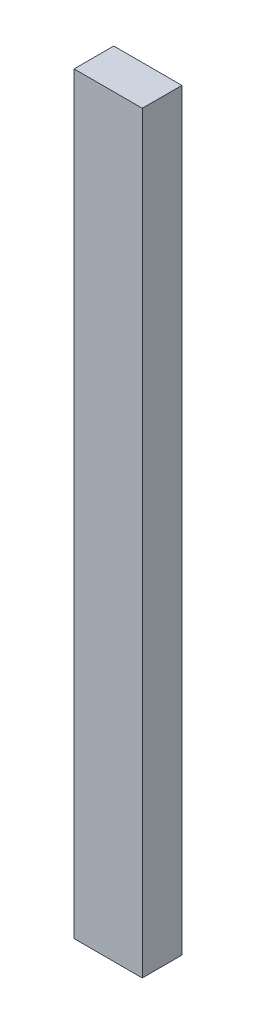
ISO-10303-21;
HEADER;
FILE_DESCRIPTION(('STEP AP214'),'2;1');
FILE_NAME('part.step','',(''),(''),'','','');
FILE_SCHEMA(('AUTOMOTIVE_DESIGN { 1 0 10303 214 1 1 1 1 }'));
ENDSEC;
DATA;
#1=APPLICATION_CONTEXT('core data for automotive mechanical design processes');
#2=APPLICATION_PROTOCOL_DEFINITION('international standard','automotive_design',2000,#1);
#3=PRODUCT_CONTEXT('',#1,'mechanical');
#4=PRODUCT('Part','Part','',(#3));
#5=PRODUCT_RELATED_PRODUCT_CATEGORY('part','',(#4));
#6=PRODUCT_DEFINITION_FORMATION('','',#4);
#7=PRODUCT_DEFINITION_CONTEXT('part definition',#1,'design');
#8=PRODUCT_DEFINITION('design','',#6,#7);
#9=PRODUCT_DEFINITION_SHAPE('','',#8);
#10=(LENGTH_UNIT() NAMED_UNIT(*) SI_UNIT(.MILLI.,.METRE.));
#11=(NAMED_UNIT(*) PLANE_ANGLE_UNIT() SI_UNIT($,.RADIAN.));
#12=(NAMED_UNIT(*) SI_UNIT($,.STERADIAN.) SOLID_ANGLE_UNIT());
#13=UNCERTAINTY_MEASURE_WITH_UNIT(LENGTH_MEASURE(1.E-05),#10,'distance_accuracy_value','');
#14=(GEOMETRIC_REPRESENTATION_CONTEXT(3) GLOBAL_UNCERTAINTY_ASSIGNED_CONTEXT((#13)) GLOBAL_UNIT_ASSIGNED_CONTEXT((#10,
#11,#12)) REPRESENTATION_CONTEXT('',''));
#15=CARTESIAN_POINT('',(0.,0.,0.));
#16=DIRECTION('',(0.,0.,1.));
#17=DIRECTION('',(1.,0.,0.));
#18=AXIS2_PLACEMENT_3D('',#15,#16,#17);
#19=CARTESIAN_POINT('',(0.,482.6,0.));
#20=DIRECTION('',(0.,0.,-1.));
#21=DIRECTION('',(-1.,0.,0.));
#22=AXIS2_PLACEMENT_3D('',#19,#20,#21);
#23=PLANE('',#22);
#24=DIRECTION('',(1.,0.,0.));
#25=VECTOR('',#24,1.);
#26=CARTESIAN_POINT('',(0.,0.,0.));
#27=LINE('',#26,#25);
#28=CARTESIAN_POINT('',(-18.288,0.,0.));
#29=VERTEX_POINT('',#28);
#30=CARTESIAN_POINT('',(25.4,0.,0.));
#31=VERTEX_POINT('',#30);
#32=EDGE_CURVE('E67',#29,#31,#27,.T.);
#33=ORIENTED_EDGE('',*,*,#32,.T.);
#34=DIRECTION('',(0.,-1.,0.));
#35=VECTOR('',#34,1.);
#36=CARTESIAN_POINT('',(25.4,482.6,0.));
#37=LINE('',#36,#35);
#38=CARTESIAN_POINT('',(25.4,482.6,0.));
#39=VERTEX_POINT('',#38);
#40=EDGE_CURVE('E48',#39,#31,#37,.T.);
#41=ORIENTED_EDGE('',*,*,#40,.F.);
#42=DIRECTION('',(1.,0.,0.));
#43=VECTOR('',#42,1.);
#44=CARTESIAN_POINT('',(0.,482.6,0.));
#45=LINE('',#44,#43);
#46=CARTESIAN_POINT('',(-18.288,482.6,0.));
#47=VERTEX_POINT('',#46);
#48=EDGE_CURVE('E82',#47,#39,#45,.T.);
#49=ORIENTED_EDGE('',*,*,#48,.F.);
#50=DIRECTION('',(0.,1.,0.));
#51=VECTOR('',#50,1.);
#52=CARTESIAN_POINT('',(-18.288,0.,0.));
#53=LINE('',#52,#51);
#54=EDGE_CURVE('E85',#29,#47,#53,.T.);
#55=ORIENTED_EDGE('',*,*,#54,.F.);
#56=EDGE_LOOP('',(#33,#41,#49,#55));
#57=FACE_BOUND('',#56,.T.);
#58=ADVANCED_FACE('F39',(#57),#23,.F.);
#59=CARTESIAN_POINT('',(25.4,482.6,0.));
#60=DIRECTION('',(-1.,0.,0.));
#61=DIRECTION('',(0.,0.,1.));
#62=AXIS2_PLACEMENT_3D('',#59,#60,#61);
#63=PLANE('',#62);
#64=DIRECTION('',(0.,0.,-1.));
#65=VECTOR('',#64,1.);
#66=CARTESIAN_POINT('',(25.4,0.,0.));
#67=LINE('',#66,#65);
#68=CARTESIAN_POINT('',(25.4,0.,-25.4));
#69=VERTEX_POINT('',#68);
#70=EDGE_CURVE('E120',#31,#69,#67,.T.);
#71=ORIENTED_EDGE('',*,*,#70,.T.);
#72=DIRECTION('',(0.,-1.,0.));
#73=VECTOR('',#72,1.);
#74=CARTESIAN_POINT('',(25.4,482.6,-25.4));
#75=LINE('',#74,#73);
#76=CARTESIAN_POINT('',(25.4,482.6,-25.4));
#77=VERTEX_POINT('',#76);
#78=EDGE_CURVE('E117',#77,#69,#75,.T.);
#79=ORIENTED_EDGE('',*,*,#78,.F.);
#80=DIRECTION('',(0.,0.,-1.));
#81=VECTOR('',#80,1.);
#82=CARTESIAN_POINT('',(25.4,482.6,0.));
#83=LINE('',#82,#81);
#84=EDGE_CURVE('E56',#39,#77,#83,.T.);
#85=ORIENTED_EDGE('',*,*,#84,.F.);
#86=ORIENTED_EDGE('',*,*,#40,.T.);
#87=EDGE_LOOP('',(#71,#79,#85,#86));
#88=FACE_BOUND('',#87,.T.);
#89=ADVANCED_FACE('F129',(#88),#63,.F.);
#90=CARTESIAN_POINT('',(0.,482.6,-25.4));
#91=DIRECTION('',(0.,0.,1.));
#92=DIRECTION('',(1.,0.,0.));
#93=AXIS2_PLACEMENT_3D('',#90,#91,#92);
#94=PLANE('',#93);
#95=CARTESIAN_POINT('',(12.7,469.9,-25.4));
#96=DIRECTION('',(0.,0.,1.));
#97=DIRECTION('',(1.,0.,0.));
#98=AXIS2_PLACEMENT_3D('',#95,#96,#97);
#99=CIRCLE('',#98,6.35);
#100=CARTESIAN_POINT('',(19.05,469.9,-25.4));
#101=VERTEX_POINT('',#100);
#102=EDGE_CURVE('E11',#101,#101,#99,.F.);
#103=ORIENTED_EDGE('',*,*,#102,.F.);
#104=EDGE_LOOP('',(#103));
#105=FACE_BOUND('',#104,.T.);
#106=DIRECTION('',(-1.,0.,0.));
#107=VECTOR('',#106,1.);
#108=CARTESIAN_POINT('',(0.,0.,-25.4));
#109=LINE('',#108,#107);
#110=CARTESIAN_POINT('',(-18.288,0.,-25.4));
#111=VERTEX_POINT('',#110);
#112=EDGE_CURVE('E87',#69,#111,#109,.T.);
#113=ORIENTED_EDGE('',*,*,#112,.T.);
#114=DIRECTION('',(0.,-1.,0.));
#115=VECTOR('',#114,1.);
#116=CARTESIAN_POINT('',(-18.288,0.,-25.4));
#117=LINE('',#116,#115);
#118=CARTESIAN_POINT('',(-18.288,482.6,-25.4));
#119=VERTEX_POINT('',#118);
#120=EDGE_CURVE('E98',#119,#111,#117,.T.);
#121=ORIENTED_EDGE('',*,*,#120,.F.);
#122=DIRECTION('',(-1.,0.,0.));
#123=VECTOR('',#122,1.);
#124=CARTESIAN_POINT('',(0.,482.6,-25.4));
#125=LINE('',#124,#123);
#126=EDGE_CURVE('E93',#77,#119,#125,.T.);
#127=ORIENTED_EDGE('',*,*,#126,.F.);
#128=ORIENTED_EDGE('',*,*,#78,.T.);
#129=EDGE_LOOP('',(#113,#121,#127,#128));
#130=FACE_BOUND('',#129,.T.);
#131=ADVANCED_FACE('F133',(#105,#130),#94,.F.);
#132=CARTESIAN_POINT('',(0.,482.6,0.));
#133=DIRECTION('',(0.,-1.,0.));
#134=DIRECTION('',(0.,0.,-1.));
#135=AXIS2_PLACEMENT_3D('',#132,#133,#134);
#136=PLANE('',#135);
#137=ORIENTED_EDGE('',*,*,#126,.T.);
#138=DIRECTION('',(0.,0.,-1.));
#139=VECTOR('',#138,1.);
#140=CARTESIAN_POINT('',(-18.288,482.6,0.));
#141=LINE('',#140,#139);
#142=EDGE_CURVE('E90',#47,#119,#141,.T.);
#143=ORIENTED_EDGE('',*,*,#142,.F.);
#144=ORIENTED_EDGE('',*,*,#48,.T.);
#145=ORIENTED_EDGE('',*,*,#84,.T.);
#146=EDGE_LOOP('',(#137,#143,#144,#145));
#147=FACE_BOUND('',#146,.T.);
#148=ADVANCED_FACE('F91',(#147),#136,.F.);
#149=CARTESIAN_POINT('',(0.,0.,0.));
#150=DIRECTION('',(0.,-1.,0.));
#151=DIRECTION('',(0.,0.,-1.));
#152=AXIS2_PLACEMENT_3D('',#149,#150,#151);
#153=PLANE('',#152);
#154=ORIENTED_EDGE('',*,*,#32,.F.);
#155=DIRECTION('',(0.,0.,1.));
#156=VECTOR('',#155,1.);
#157=CARTESIAN_POINT('',(-18.288,0.,0.));
#158=LINE('',#157,#156);
#159=EDGE_CURVE('E101',#111,#29,#158,.T.);
#160=ORIENTED_EDGE('',*,*,#159,.F.);
#161=ORIENTED_EDGE('',*,*,#112,.F.);
#162=ORIENTED_EDGE('',*,*,#70,.F.);
#163=EDGE_LOOP('',(#154,#160,#161,#162));
#164=FACE_BOUND('',#163,.T.);
#165=ADVANCED_FACE('F131',(#164),#153,.T.);
#166=CARTESIAN_POINT('',(12.7,469.9,-31.75));
#167=DIRECTION('',(0.,0.,1.));
#168=DIRECTION('',(1.,0.,0.));
#169=AXIS2_PLACEMENT_3D('',#166,#167,#168);
#170=CYLINDRICAL_SURFACE('',#169,6.35);
#171=CARTESIAN_POINT('',(12.7,469.9,-31.75));
#172=DIRECTION('',(0.,0.,-1.));
#173=DIRECTION('',(-1.,0.,0.));
#174=AXIS2_PLACEMENT_3D('',#171,#172,#173);
#175=CIRCLE('',#174,6.35);
#176=CARTESIAN_POINT('',(6.35,469.9,-31.75));
#177=VERTEX_POINT('',#176);
#178=EDGE_CURVE('E109',#177,#177,#175,.T.);
#179=ORIENTED_EDGE('',*,*,#178,.F.);
#180=EDGE_LOOP('',(#179));
#181=FACE_BOUND('',#180,.T.);
#182=ORIENTED_EDGE('',*,*,#102,.T.);
#183=EDGE_LOOP('',(#182));
#184=FACE_BOUND('',#183,.T.);
#185=ADVANCED_FACE('F159',(#181,#184),#170,.T.);
#186=CARTESIAN_POINT('',(12.7,469.9,-31.75));
#187=DIRECTION('',(0.,0.,-1.));
#188=DIRECTION('',(-1.,0.,0.));
#189=AXIS2_PLACEMENT_3D('',#186,#187,#188);
#190=PLANE('',#189);
#191=ORIENTED_EDGE('',*,*,#178,.T.);
#192=EDGE_LOOP('',(#191));
#193=FACE_BOUND('',#192,.T.);
#194=ADVANCED_FACE('F163',(#193),#190,.T.);
#195=CARTESIAN_POINT('',(-18.288,0.,0.));
#196=DIRECTION('',(-1.,0.,0.));
#197=DIRECTION('',(0.,0.,1.));
#198=AXIS2_PLACEMENT_3D('',#195,#196,#197);
#199=PLANE('',#198);
#200=ORIENTED_EDGE('',*,*,#54,.T.);
#201=ORIENTED_EDGE('',*,*,#142,.T.);
#202=ORIENTED_EDGE('',*,*,#120,.T.);
#203=ORIENTED_EDGE('',*,*,#159,.T.);
#204=EDGE_LOOP('',(#200,#201,#202,#203));
#205=FACE_BOUND('',#204,.T.);
#206=ADVANCED_FACE('F100',(#205),#199,.T.);
#207=CLOSED_SHELL('',(#58,#89,#131,#148,#165,#185,#194,#206));
#208=MANIFOLD_SOLID_BREP('B2',#207);
#209=ADVANCED_BREP_SHAPE_REPRESENTATION('',(#18,#208),#14);
#210=SHAPE_DEFINITION_REPRESENTATION(#9,#209);
ENDSEC;
END-ISO-10303-21;
